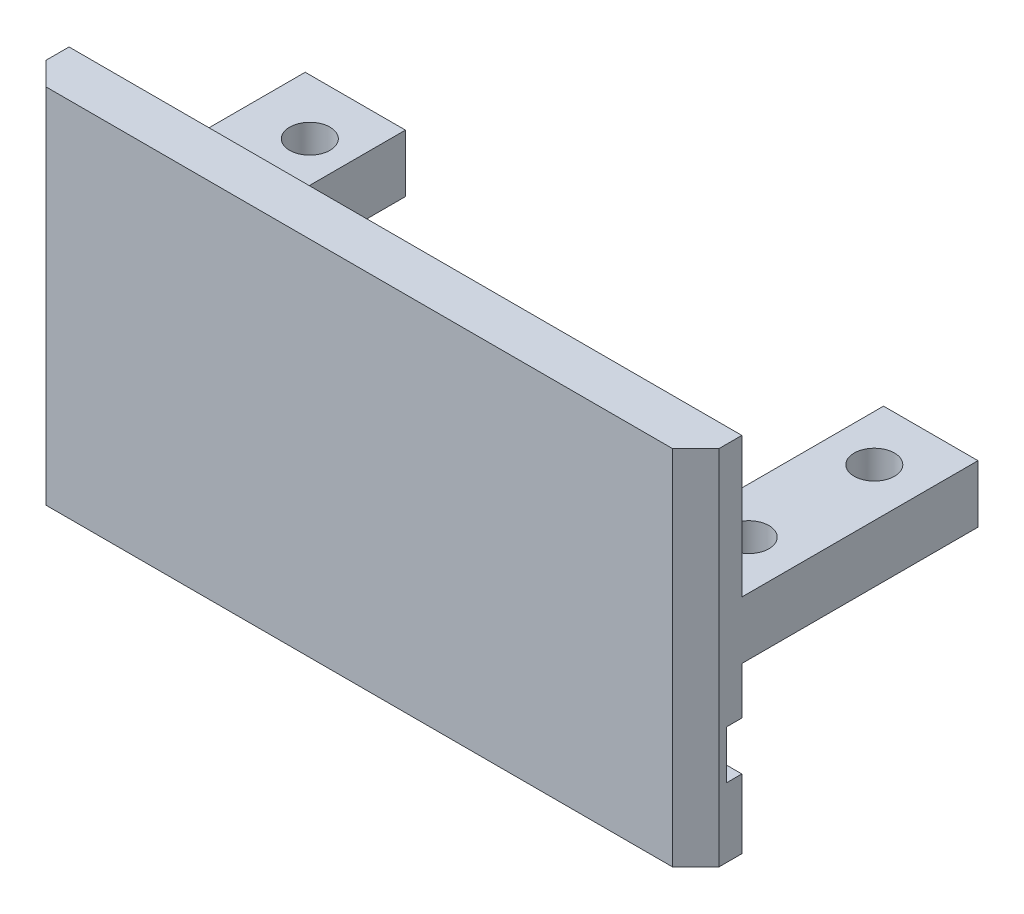
ISO-10303-21;
HEADER;
FILE_DESCRIPTION(('STEP AP214'),'2;1');
FILE_NAME('part.step','',(''),(''),'','','');
FILE_SCHEMA(('AUTOMOTIVE_DESIGN { 1 0 10303 214 1 1 1 1 }'));
ENDSEC;
DATA;
#1=APPLICATION_CONTEXT('core data for automotive mechanical design processes');
#2=APPLICATION_PROTOCOL_DEFINITION('international standard','automotive_design',2000,#1);
#3=PRODUCT_CONTEXT('',#1,'mechanical');
#4=PRODUCT('Part','Part','',(#3));
#5=PRODUCT_RELATED_PRODUCT_CATEGORY('part','',(#4));
#6=PRODUCT_DEFINITION_FORMATION('','',#4);
#7=PRODUCT_DEFINITION_CONTEXT('part definition',#1,'design');
#8=PRODUCT_DEFINITION('design','',#6,#7);
#9=PRODUCT_DEFINITION_SHAPE('','',#8);
#10=(LENGTH_UNIT() NAMED_UNIT(*) SI_UNIT(.MILLI.,.METRE.));
#11=(NAMED_UNIT(*) PLANE_ANGLE_UNIT() SI_UNIT($,.RADIAN.));
#12=(NAMED_UNIT(*) SI_UNIT($,.STERADIAN.) SOLID_ANGLE_UNIT());
#13=UNCERTAINTY_MEASURE_WITH_UNIT(LENGTH_MEASURE(1.E-05),#10,'distance_accuracy_value','');
#14=(GEOMETRIC_REPRESENTATION_CONTEXT(3) GLOBAL_UNCERTAINTY_ASSIGNED_CONTEXT((#13)) GLOBAL_UNIT_ASSIGNED_CONTEXT((#10,
#11,#12)) REPRESENTATION_CONTEXT('',''));
#15=CARTESIAN_POINT('',(0.,0.,0.));
#16=DIRECTION('',(0.,0.,1.));
#17=DIRECTION('',(1.,0.,0.));
#18=AXIS2_PLACEMENT_3D('',#15,#16,#17);
#19=CARTESIAN_POINT('',(0.,0.,0.));
#20=DIRECTION('',(0.,0.,1.));
#21=DIRECTION('',(1.,0.,0.));
#22=AXIS2_PLACEMENT_3D('',#19,#20,#21);
#23=PLANE('',#22);
#24=DIRECTION('',(0.,1.,0.));
#25=VECTOR('',#24,1.);
#26=CARTESIAN_POINT('',(29.2,15.725,0.));
#27=LINE('',#26,#25);
#28=CARTESIAN_POINT('',(29.2,-5.525,0.));
#29=VERTEX_POINT('',#28);
#30=CARTESIAN_POINT('',(29.2,-1.425,0.));
#31=VERTEX_POINT('',#30);
#32=EDGE_CURVE('E290',#29,#31,#27,.T.);
#33=ORIENTED_EDGE('',*,*,#32,.F.);
#34=DIRECTION('',(1.,0.,0.));
#35=VECTOR('',#34,1.);
#36=CARTESIAN_POINT('',(29.2,-5.525,0.));
#37=LINE('',#36,#35);
#38=CARTESIAN_POINT('',(-29.2,-5.525,0.));
#39=VERTEX_POINT('',#38);
#40=EDGE_CURVE('E186',#39,#29,#37,.T.);
#41=ORIENTED_EDGE('',*,*,#40,.F.);
#42=DIRECTION('',(0.,-1.,0.));
#43=VECTOR('',#42,1.);
#44=CARTESIAN_POINT('',(-29.2,15.725,0.));
#45=LINE('',#44,#43);
#46=CARTESIAN_POINT('',(-29.2,-1.425,0.));
#47=VERTEX_POINT('',#46);
#48=EDGE_CURVE('E297',#47,#39,#45,.T.);
#49=ORIENTED_EDGE('',*,*,#48,.F.);
#50=DIRECTION('',(-1.,0.,0.));
#51=VECTOR('',#50,1.);
#52=CARTESIAN_POINT('',(-20.5,-1.425,0.));
#53=LINE('',#52,#51);
#54=CARTESIAN_POINT('',(-20.5,-1.425,0.));
#55=VERTEX_POINT('',#54);
#56=EDGE_CURVE('E235',#55,#47,#53,.T.);
#57=ORIENTED_EDGE('',*,*,#56,.F.);
#58=DIRECTION('',(0.,-1.,0.));
#59=VECTOR('',#58,1.);
#60=CARTESIAN_POINT('',(-20.5,3.575,0.));
#61=LINE('',#60,#59);
#62=CARTESIAN_POINT('',(-20.5,3.575,0.));
#63=VERTEX_POINT('',#62);
#64=EDGE_CURVE('E239',#63,#55,#61,.T.);
#65=ORIENTED_EDGE('',*,*,#64,.F.);
#66=DIRECTION('',(1.,0.,0.));
#67=VECTOR('',#66,1.);
#68=CARTESIAN_POINT('',(-20.5,3.575,0.));
#69=LINE('',#68,#67);
#70=CARTESIAN_POINT('',(-29.2,3.575,0.));
#71=VERTEX_POINT('',#70);
#72=EDGE_CURVE('E233',#71,#63,#69,.T.);
#73=ORIENTED_EDGE('',*,*,#72,.F.);
#74=CARTESIAN_POINT('',(-29.2,15.725,0.));
#75=VERTEX_POINT('',#74);
#76=EDGE_CURVE('E294',#75,#71,#45,.T.);
#77=ORIENTED_EDGE('',*,*,#76,.F.);
#78=DIRECTION('',(-1.,0.,0.));
#79=VECTOR('',#78,1.);
#80=CARTESIAN_POINT('',(-29.2,15.725,0.));
#81=LINE('',#80,#79);
#82=CARTESIAN_POINT('',(29.2,15.725,0.));
#83=VERTEX_POINT('',#82);
#84=EDGE_CURVE('E289',#83,#75,#81,.T.);
#85=ORIENTED_EDGE('',*,*,#84,.F.);
#86=CARTESIAN_POINT('',(29.2,3.575,0.));
#87=VERTEX_POINT('',#86);
#88=EDGE_CURVE('E279',#87,#83,#27,.T.);
#89=ORIENTED_EDGE('',*,*,#88,.F.);
#90=DIRECTION('',(1.,0.,0.));
#91=VECTOR('',#90,1.);
#92=CARTESIAN_POINT('',(29.2,3.575,0.));
#93=LINE('',#92,#91);
#94=CARTESIAN_POINT('',(21.,3.575,0.));
#95=VERTEX_POINT('',#94);
#96=EDGE_CURVE('E254',#95,#87,#93,.T.);
#97=ORIENTED_EDGE('',*,*,#96,.F.);
#98=DIRECTION('',(0.,1.,0.));
#99=VECTOR('',#98,1.);
#100=CARTESIAN_POINT('',(21.,3.575,0.));
#101=LINE('',#100,#99);
#102=CARTESIAN_POINT('',(21.,-1.425,0.));
#103=VERTEX_POINT('',#102);
#104=EDGE_CURVE('E263',#103,#95,#101,.T.);
#105=ORIENTED_EDGE('',*,*,#104,.F.);
#106=DIRECTION('',(-1.,0.,0.));
#107=VECTOR('',#106,1.);
#108=CARTESIAN_POINT('',(29.2,-1.425,0.));
#109=LINE('',#108,#107);
#110=EDGE_CURVE('E242',#31,#103,#109,.T.);
#111=ORIENTED_EDGE('',*,*,#110,.F.);
#112=EDGE_LOOP('',(#33,#41,#49,#57,#65,#73,#77,#85,#89,#97,#105,#111));
#113=FACE_BOUND('',#112,.T.);
#114=ADVANCED_FACE('F42',(#113),#23,.F.);
#115=CARTESIAN_POINT('',(-29.2,-9.725,0.));
#116=VERTEX_POINT('',#115);
#117=CARTESIAN_POINT('',(-29.2,-15.725,0.));
#118=VERTEX_POINT('',#117);
#119=EDGE_CURVE('E293',#116,#118,#45,.T.);
#120=ORIENTED_EDGE('',*,*,#119,.F.);
#121=DIRECTION('',(-1.,0.,0.));
#122=VECTOR('',#121,1.);
#123=CARTESIAN_POINT('',(29.2,-9.725,0.));
#124=LINE('',#123,#122);
#125=CARTESIAN_POINT('',(29.2,-9.725,0.));
#126=VERTEX_POINT('',#125);
#127=EDGE_CURVE('E348',#126,#116,#124,.T.);
#128=ORIENTED_EDGE('',*,*,#127,.F.);
#129=CARTESIAN_POINT('',(29.2,-15.725,0.));
#130=VERTEX_POINT('',#129);
#131=EDGE_CURVE('E191',#130,#126,#27,.T.);
#132=ORIENTED_EDGE('',*,*,#131,.F.);
#133=DIRECTION('',(1.,0.,0.));
#134=VECTOR('',#133,1.);
#135=CARTESIAN_POINT('',(-29.2,-15.725,0.));
#136=LINE('',#135,#134);
#137=EDGE_CURVE('E284',#118,#130,#136,.T.);
#138=ORIENTED_EDGE('',*,*,#137,.F.);
#139=EDGE_LOOP('',(#120,#128,#132,#138));
#140=FACE_BOUND('',#139,.T.);
#141=ADVANCED_FACE('F347',(#140),#23,.F.);
#142=CARTESIAN_POINT('',(29.2,15.725,4.));
#143=DIRECTION('',(-1.,0.,0.));
#144=DIRECTION('',(0.,-1.,0.));
#145=AXIS2_PLACEMENT_3D('',#142,#143,#144);
#146=PLANE('',#145);
#147=DIRECTION('',(0.,0.,-1.));
#148=VECTOR('',#147,1.);
#149=CARTESIAN_POINT('',(29.2,15.725,4.));
#150=LINE('',#149,#148);
#151=CARTESIAN_POINT('',(29.2,15.725,2.));
#152=VERTEX_POINT('',#151);
#153=EDGE_CURVE('E305',#152,#83,#150,.T.);
#154=ORIENTED_EDGE('',*,*,#153,.F.);
#155=DIRECTION('',(0.,-1.,0.));
#156=VECTOR('',#155,1.);
#157=CARTESIAN_POINT('',(29.2,-15.725,2.));
#158=LINE('',#157,#156);
#159=CARTESIAN_POINT('',(29.2,-15.725,2.));
#160=VERTEX_POINT('',#159);
#161=EDGE_CURVE('E66',#152,#160,#158,.T.);
#162=ORIENTED_EDGE('',*,*,#161,.T.);
#163=DIRECTION('',(0.,0.,-1.));
#164=VECTOR('',#163,1.);
#165=CARTESIAN_POINT('',(29.2,-15.725,4.));
#166=LINE('',#165,#164);
#167=EDGE_CURVE('E287',#160,#130,#166,.T.);
#168=ORIENTED_EDGE('',*,*,#167,.T.);
#169=ORIENTED_EDGE('',*,*,#131,.T.);
#170=DIRECTION('',(0.,0.,-1.));
#171=VECTOR('',#170,1.);
#172=CARTESIAN_POINT('',(29.2,-9.725,1.35));
#173=LINE('',#172,#171);
#174=CARTESIAN_POINT('',(29.2,-9.725,1.35));
#175=VERTEX_POINT('',#174);
#176=EDGE_CURVE('E171',#175,#126,#173,.T.);
#177=ORIENTED_EDGE('',*,*,#176,.F.);
#178=DIRECTION('',(0.,-1.,0.));
#179=VECTOR('',#178,1.);
#180=CARTESIAN_POINT('',(29.2,-5.525,1.35));
#181=LINE('',#180,#179);
#182=CARTESIAN_POINT('',(29.2,-5.525,1.35));
#183=VERTEX_POINT('',#182);
#184=EDGE_CURVE('E178',#183,#175,#181,.T.);
#185=ORIENTED_EDGE('',*,*,#184,.F.);
#186=DIRECTION('',(0.,0.,-1.));
#187=VECTOR('',#186,1.);
#188=CARTESIAN_POINT('',(29.2,-5.525,1.35));
#189=LINE('',#188,#187);
#190=EDGE_CURVE('E202',#183,#29,#189,.T.);
#191=ORIENTED_EDGE('',*,*,#190,.T.);
#192=ORIENTED_EDGE('',*,*,#32,.T.);
#193=DIRECTION('',(0.,0.,1.));
#194=VECTOR('',#193,1.);
#195=CARTESIAN_POINT('',(29.2,-1.425,-20.5));
#196=LINE('',#195,#194);
#197=CARTESIAN_POINT('',(29.2,-1.425,-20.5));
#198=VERTEX_POINT('',#197);
#199=EDGE_CURVE('E276',#198,#31,#196,.T.);
#200=ORIENTED_EDGE('',*,*,#199,.F.);
#201=DIRECTION('',(0.,-1.,0.));
#202=VECTOR('',#201,1.);
#203=CARTESIAN_POINT('',(29.2,3.575,-20.5));
#204=LINE('',#203,#202);
#205=CARTESIAN_POINT('',(29.2,3.575,-20.5));
#206=VERTEX_POINT('',#205);
#207=EDGE_CURVE('E250',#206,#198,#204,.T.);
#208=ORIENTED_EDGE('',*,*,#207,.F.);
#209=DIRECTION('',(0.,0.,1.));
#210=VECTOR('',#209,1.);
#211=CARTESIAN_POINT('',(29.2,3.575,-20.5));
#212=LINE('',#211,#210);
#213=EDGE_CURVE('E260',#206,#87,#212,.T.);
#214=ORIENTED_EDGE('',*,*,#213,.T.);
#215=ORIENTED_EDGE('',*,*,#88,.T.);
#216=EDGE_LOOP('',(#154,#162,#168,#169,#177,#185,#191,#192,#200,#208,#214,#215));
#217=FACE_BOUND('',#216,.T.);
#218=ADVANCED_FACE('F189',(#217),#146,.F.);
#219=CARTESIAN_POINT('',(-29.2,15.725,4.));
#220=DIRECTION('',(0.,-1.,0.));
#221=DIRECTION('',(0.,0.,-1.));
#222=AXIS2_PLACEMENT_3D('',#219,#220,#221);
#223=PLANE('',#222);
#224=DIRECTION('',(-1.,0.,0.));
#225=VECTOR('',#224,1.);
#226=CARTESIAN_POINT('',(-29.2,15.725,4.));
#227=LINE('',#226,#225);
#228=CARTESIAN_POINT('',(27.2,15.725,4.));
#229=VERTEX_POINT('',#228);
#230=CARTESIAN_POINT('',(-27.2,15.725,4.));
#231=VERTEX_POINT('',#230);
#232=EDGE_CURVE('E280',#229,#231,#227,.T.);
#233=ORIENTED_EDGE('',*,*,#232,.F.);
#234=DIRECTION('',(0.707106781186547,0.,-0.707106781186548));
#235=VECTOR('',#234,1.);
#236=CARTESIAN_POINT('',(27.2,15.725,4.));
#237=LINE('',#236,#235);
#238=EDGE_CURVE('E315',#229,#152,#237,.T.);
#239=ORIENTED_EDGE('',*,*,#238,.T.);
#240=ORIENTED_EDGE('',*,*,#153,.T.);
#241=ORIENTED_EDGE('',*,*,#84,.T.);
#242=DIRECTION('',(0.,0.,-1.));
#243=VECTOR('',#242,1.);
#244=CARTESIAN_POINT('',(-29.2,15.725,4.));
#245=LINE('',#244,#243);
#246=CARTESIAN_POINT('',(-29.2,15.725,2.));
#247=VERTEX_POINT('',#246);
#248=EDGE_CURVE('E303',#247,#75,#245,.T.);
#249=ORIENTED_EDGE('',*,*,#248,.F.);
#250=DIRECTION('',(0.707106781186548,0.,0.707106781186547));
#251=VECTOR('',#250,1.);
#252=CARTESIAN_POINT('',(-27.2,15.725,4.));
#253=LINE('',#252,#251);
#254=EDGE_CURVE('E313',#247,#231,#253,.T.);
#255=ORIENTED_EDGE('',*,*,#254,.T.);
#256=EDGE_LOOP('',(#233,#239,#240,#241,#249,#255));
#257=FACE_BOUND('',#256,.T.);
#258=ADVANCED_FACE('F328',(#257),#223,.F.);
#259=CARTESIAN_POINT('',(-29.2,15.725,4.));
#260=DIRECTION('',(1.,0.,0.));
#261=DIRECTION('',(0.,1.,0.));
#262=AXIS2_PLACEMENT_3D('',#259,#260,#261);
#263=PLANE('',#262);
#264=DIRECTION('',(0.,0.,-1.));
#265=VECTOR('',#264,1.);
#266=CARTESIAN_POINT('',(-29.2,-15.725,4.));
#267=LINE('',#266,#265);
#268=CARTESIAN_POINT('',(-29.2,-15.725,2.));
#269=VERTEX_POINT('',#268);
#270=EDGE_CURVE('E301',#269,#118,#267,.T.);
#271=ORIENTED_EDGE('',*,*,#270,.F.);
#272=DIRECTION('',(0.,1.,0.));
#273=VECTOR('',#272,1.);
#274=CARTESIAN_POINT('',(-29.2,15.725,2.));
#275=LINE('',#274,#273);
#276=EDGE_CURVE('E11',#269,#247,#275,.T.);
#277=ORIENTED_EDGE('',*,*,#276,.T.);
#278=ORIENTED_EDGE('',*,*,#248,.T.);
#279=ORIENTED_EDGE('',*,*,#76,.T.);
#280=DIRECTION('',(0.,0.,1.));
#281=VECTOR('',#280,1.);
#282=CARTESIAN_POINT('',(-29.2,3.575,-20.5));
#283=LINE('',#282,#281);
#284=CARTESIAN_POINT('',(-29.2,3.575,-20.5));
#285=VERTEX_POINT('',#284);
#286=EDGE_CURVE('E227',#285,#71,#283,.T.);
#287=ORIENTED_EDGE('',*,*,#286,.F.);
#288=DIRECTION('',(0.,1.,0.));
#289=VECTOR('',#288,1.);
#290=CARTESIAN_POINT('',(-29.2,3.575,-20.5));
#291=LINE('',#290,#289);
#292=CARTESIAN_POINT('',(-29.2,-1.425,-20.5));
#293=VERTEX_POINT('',#292);
#294=EDGE_CURVE('E244',#293,#285,#291,.T.);
#295=ORIENTED_EDGE('',*,*,#294,.F.);
#296=DIRECTION('',(0.,0.,1.));
#297=VECTOR('',#296,1.);
#298=CARTESIAN_POINT('',(-29.2,-1.425,-20.5));
#299=LINE('',#298,#297);
#300=EDGE_CURVE('E225',#293,#47,#299,.T.);
#301=ORIENTED_EDGE('',*,*,#300,.T.);
#302=ORIENTED_EDGE('',*,*,#48,.T.);
#303=DIRECTION('',(0.,0.,-1.));
#304=VECTOR('',#303,1.);
#305=CARTESIAN_POINT('',(-29.2,-5.525,1.35));
#306=LINE('',#305,#304);
#307=CARTESIAN_POINT('',(-29.2,-5.525,1.35));
#308=VERTEX_POINT('',#307);
#309=EDGE_CURVE('E193',#308,#39,#306,.T.);
#310=ORIENTED_EDGE('',*,*,#309,.F.);
#311=DIRECTION('',(0.,1.,0.));
#312=VECTOR('',#311,1.);
#313=CARTESIAN_POINT('',(-29.2,-5.525,1.35));
#314=LINE('',#313,#312);
#315=CARTESIAN_POINT('',(-29.2,-9.725,1.35));
#316=VERTEX_POINT('',#315);
#317=EDGE_CURVE('E177',#316,#308,#314,.T.);
#318=ORIENTED_EDGE('',*,*,#317,.F.);
#319=DIRECTION('',(0.,0.,-1.));
#320=VECTOR('',#319,1.);
#321=CARTESIAN_POINT('',(-29.2,-9.725,1.35));
#322=LINE('',#321,#320);
#323=EDGE_CURVE('E174',#316,#116,#322,.T.);
#324=ORIENTED_EDGE('',*,*,#323,.T.);
#325=ORIENTED_EDGE('',*,*,#119,.T.);
#326=EDGE_LOOP('',(#271,#277,#278,#279,#287,#295,#301,#302,#310,#318,#324,#325));
#327=FACE_BOUND('',#326,.T.);
#328=ADVANCED_FACE('F342',(#327),#263,.F.);
#329=CARTESIAN_POINT('',(-29.2,-15.725,4.));
#330=DIRECTION('',(0.,1.,0.));
#331=DIRECTION('',(0.,0.,1.));
#332=AXIS2_PLACEMENT_3D('',#329,#330,#331);
#333=PLANE('',#332);
#334=ORIENTED_EDGE('',*,*,#167,.F.);
#335=DIRECTION('',(-0.707106781186547,0.,0.707106781186548));
#336=VECTOR('',#335,1.);
#337=CARTESIAN_POINT('',(27.2,-15.725,4.));
#338=LINE('',#337,#336);
#339=CARTESIAN_POINT('',(27.2,-15.725,4.));
#340=VERTEX_POINT('',#339);
#341=EDGE_CURVE('E51',#160,#340,#338,.T.);
#342=ORIENTED_EDGE('',*,*,#341,.T.);
#343=DIRECTION('',(1.,0.,0.));
#344=VECTOR('',#343,1.);
#345=CARTESIAN_POINT('',(-29.2,-15.725,4.));
#346=LINE('',#345,#344);
#347=CARTESIAN_POINT('',(-27.2,-15.725,4.));
#348=VERTEX_POINT('',#347);
#349=EDGE_CURVE('E283',#348,#340,#346,.T.);
#350=ORIENTED_EDGE('',*,*,#349,.F.);
#351=DIRECTION('',(-0.707106781186548,0.,-0.707106781186547));
#352=VECTOR('',#351,1.);
#353=CARTESIAN_POINT('',(-27.2,-15.725,4.));
#354=LINE('',#353,#352);
#355=EDGE_CURVE('E58',#348,#269,#354,.T.);
#356=ORIENTED_EDGE('',*,*,#355,.T.);
#357=ORIENTED_EDGE('',*,*,#270,.T.);
#358=ORIENTED_EDGE('',*,*,#137,.T.);
#359=EDGE_LOOP('',(#334,#342,#350,#356,#357,#358));
#360=FACE_BOUND('',#359,.T.);
#361=ADVANCED_FACE('F319',(#360),#333,.F.);
#362=CARTESIAN_POINT('',(0.,0.,4.));
#363=DIRECTION('',(0.,0.,1.));
#364=DIRECTION('',(1.,0.,0.));
#365=AXIS2_PLACEMENT_3D('',#362,#363,#364);
#366=PLANE('',#365);
#367=ORIENTED_EDGE('',*,*,#349,.T.);
#368=DIRECTION('',(0.,1.,0.));
#369=VECTOR('',#368,1.);
#370=CARTESIAN_POINT('',(27.2,15.725,4.));
#371=LINE('',#370,#369);
#372=EDGE_CURVE('E310',#340,#229,#371,.T.);
#373=ORIENTED_EDGE('',*,*,#372,.T.);
#374=ORIENTED_EDGE('',*,*,#232,.T.);
#375=DIRECTION('',(0.,-1.,0.));
#376=VECTOR('',#375,1.);
#377=CARTESIAN_POINT('',(-27.2,-15.725,4.));
#378=LINE('',#377,#376);
#379=EDGE_CURVE('E307',#231,#348,#378,.T.);
#380=ORIENTED_EDGE('',*,*,#379,.T.);
#381=EDGE_LOOP('',(#367,#373,#374,#380));
#382=FACE_BOUND('',#381,.T.);
#383=ADVANCED_FACE('F323',(#382),#366,.T.);
#384=CARTESIAN_POINT('',(29.2,-1.425,-20.5));
#385=DIRECTION('',(0.,1.,0.));
#386=DIRECTION('',(0.,0.,1.));
#387=AXIS2_PLACEMENT_3D('',#384,#385,#386);
#388=PLANE('',#387);
#389=CARTESIAN_POINT('',(25.,-1.425,-15.7));
#390=DIRECTION('',(0.,1.,0.));
#391=DIRECTION('',(0.,0.,1.));
#392=AXIS2_PLACEMENT_3D('',#389,#390,#391);
#393=CIRCLE('',#392,1.75);
#394=CARTESIAN_POINT('',(25.,-1.425,-13.95));
#395=VERTEX_POINT('',#394);
#396=EDGE_CURVE('E205',#395,#395,#393,.F.);
#397=ORIENTED_EDGE('',*,*,#396,.F.);
#398=EDGE_LOOP('',(#397));
#399=FACE_BOUND('',#398,.T.);
#400=CARTESIAN_POINT('',(25.,-1.425,-4.8));
#401=DIRECTION('',(0.,1.,0.));
#402=DIRECTION('',(0.,0.,1.));
#403=AXIS2_PLACEMENT_3D('',#400,#401,#402);
#404=CIRCLE('',#403,1.75);
#405=CARTESIAN_POINT('',(25.,-1.425,-3.05));
#406=VERTEX_POINT('',#405);
#407=EDGE_CURVE('E220',#406,#406,#404,.F.);
#408=ORIENTED_EDGE('',*,*,#407,.F.);
#409=EDGE_LOOP('',(#408));
#410=FACE_BOUND('',#409,.T.);
#411=ORIENTED_EDGE('',*,*,#110,.T.);
#412=DIRECTION('',(0.,0.,1.));
#413=VECTOR('',#412,1.);
#414=CARTESIAN_POINT('',(21.,-1.425,-20.5));
#415=LINE('',#414,#413);
#416=CARTESIAN_POINT('',(21.,-1.425,-20.5));
#417=VERTEX_POINT('',#416);
#418=EDGE_CURVE('E273',#417,#103,#415,.T.);
#419=ORIENTED_EDGE('',*,*,#418,.F.);
#420=DIRECTION('',(-1.,0.,0.));
#421=VECTOR('',#420,1.);
#422=CARTESIAN_POINT('',(29.2,-1.425,-20.5));
#423=LINE('',#422,#421);
#424=EDGE_CURVE('E253',#198,#417,#423,.T.);
#425=ORIENTED_EDGE('',*,*,#424,.F.);
#426=ORIENTED_EDGE('',*,*,#199,.T.);
#427=EDGE_LOOP('',(#411,#419,#425,#426));
#428=FACE_BOUND('',#427,.T.);
#429=ADVANCED_FACE('F550',(#399,#410,#428),#388,.F.);
#430=CARTESIAN_POINT('',(21.,3.575,-20.5));
#431=DIRECTION('',(1.,0.,0.));
#432=DIRECTION('',(0.,0.,-1.));
#433=AXIS2_PLACEMENT_3D('',#430,#431,#432);
#434=PLANE('',#433);
#435=ORIENTED_EDGE('',*,*,#104,.T.);
#436=DIRECTION('',(0.,0.,1.));
#437=VECTOR('',#436,1.);
#438=CARTESIAN_POINT('',(21.,3.575,-20.5));
#439=LINE('',#438,#437);
#440=CARTESIAN_POINT('',(21.,3.575,-20.5));
#441=VERTEX_POINT('',#440);
#442=EDGE_CURVE('E270',#441,#95,#439,.T.);
#443=ORIENTED_EDGE('',*,*,#442,.F.);
#444=DIRECTION('',(0.,1.,0.));
#445=VECTOR('',#444,1.);
#446=CARTESIAN_POINT('',(21.,3.575,-20.5));
#447=LINE('',#446,#445);
#448=EDGE_CURVE('E256',#417,#441,#447,.T.);
#449=ORIENTED_EDGE('',*,*,#448,.F.);
#450=ORIENTED_EDGE('',*,*,#418,.T.);
#451=EDGE_LOOP('',(#435,#443,#449,#450));
#452=FACE_BOUND('',#451,.T.);
#453=ADVANCED_FACE('F575',(#452),#434,.F.);
#454=CARTESIAN_POINT('',(29.2,3.575,-20.5));
#455=DIRECTION('',(0.,-1.,0.));
#456=DIRECTION('',(0.,0.,-1.));
#457=AXIS2_PLACEMENT_3D('',#454,#455,#456);
#458=PLANE('',#457);
#459=CARTESIAN_POINT('',(25.,3.57499999999999,-15.7));
#460=DIRECTION('',(0.,1.,0.));
#461=DIRECTION('',(1.,0.,0.));
#462=AXIS2_PLACEMENT_3D('',#459,#460,#461);
#463=CIRCLE('',#462,1.75);
#464=CARTESIAN_POINT('',(26.75,3.57499999999999,-15.7));
#465=VERTEX_POINT('',#464);
#466=EDGE_CURVE('E210',#465,#465,#463,.T.);
#467=ORIENTED_EDGE('',*,*,#466,.F.);
#468=EDGE_LOOP('',(#467));
#469=FACE_BOUND('',#468,.T.);
#470=CARTESIAN_POINT('',(25.,3.57499999999999,-4.8));
#471=DIRECTION('',(0.,1.,0.));
#472=DIRECTION('',(-1.,0.,0.));
#473=AXIS2_PLACEMENT_3D('',#470,#471,#472);
#474=CIRCLE('',#473,1.75);
#475=CARTESIAN_POINT('',(23.25,3.575,-4.8));
#476=VERTEX_POINT('',#475);
#477=EDGE_CURVE('E213',#476,#476,#474,.T.);
#478=ORIENTED_EDGE('',*,*,#477,.F.);
#479=EDGE_LOOP('',(#478));
#480=FACE_BOUND('',#479,.T.);
#481=ORIENTED_EDGE('',*,*,#96,.T.);
#482=ORIENTED_EDGE('',*,*,#213,.F.);
#483=DIRECTION('',(1.,0.,0.));
#484=VECTOR('',#483,1.);
#485=CARTESIAN_POINT('',(29.2,3.575,-20.5));
#486=LINE('',#485,#484);
#487=EDGE_CURVE('E258',#441,#206,#486,.T.);
#488=ORIENTED_EDGE('',*,*,#487,.F.);
#489=ORIENTED_EDGE('',*,*,#442,.T.);
#490=EDGE_LOOP('',(#481,#482,#488,#489));
#491=FACE_BOUND('',#490,.T.);
#492=ADVANCED_FACE('F581',(#469,#480,#491),#458,.F.);
#493=CARTESIAN_POINT('',(0.,0.,-20.5));
#494=DIRECTION('',(0.,0.,-1.));
#495=DIRECTION('',(-1.,0.,0.));
#496=AXIS2_PLACEMENT_3D('',#493,#494,#495);
#497=PLANE('',#496);
#498=ORIENTED_EDGE('',*,*,#207,.T.);
#499=ORIENTED_EDGE('',*,*,#424,.T.);
#500=ORIENTED_EDGE('',*,*,#448,.T.);
#501=ORIENTED_EDGE('',*,*,#487,.T.);
#502=EDGE_LOOP('',(#498,#499,#500,#501));
#503=FACE_BOUND('',#502,.T.);
#504=ADVANCED_FACE('F434',(#503),#497,.T.);
#505=CARTESIAN_POINT('',(-20.5,3.575,-20.5));
#506=DIRECTION('',(-1.,0.,0.));
#507=DIRECTION('',(0.,0.,1.));
#508=AXIS2_PLACEMENT_3D('',#505,#506,#507);
#509=PLANE('',#508);
#510=ORIENTED_EDGE('',*,*,#64,.T.);
#511=DIRECTION('',(0.,0.,1.));
#512=VECTOR('',#511,1.);
#513=CARTESIAN_POINT('',(-20.5,-1.425,-20.5));
#514=LINE('',#513,#512);
#515=CARTESIAN_POINT('',(-20.5,-1.425,-20.5));
#516=VERTEX_POINT('',#515);
#517=EDGE_CURVE('E223',#516,#55,#514,.T.);
#518=ORIENTED_EDGE('',*,*,#517,.F.);
#519=DIRECTION('',(0.,-1.,0.));
#520=VECTOR('',#519,1.);
#521=CARTESIAN_POINT('',(-20.5,3.575,-20.5));
#522=LINE('',#521,#520);
#523=CARTESIAN_POINT('',(-20.5,3.575,-20.5));
#524=VERTEX_POINT('',#523);
#525=EDGE_CURVE('E236',#524,#516,#522,.T.);
#526=ORIENTED_EDGE('',*,*,#525,.F.);
#527=DIRECTION('',(0.,0.,1.));
#528=VECTOR('',#527,1.);
#529=CARTESIAN_POINT('',(-20.5,3.575,-20.5));
#530=LINE('',#529,#528);
#531=EDGE_CURVE('E229',#524,#63,#530,.T.);
#532=ORIENTED_EDGE('',*,*,#531,.T.);
#533=EDGE_LOOP('',(#510,#518,#526,#532));
#534=FACE_BOUND('',#533,.T.);
#535=ADVANCED_FACE('F369',(#534),#509,.F.);
#536=CARTESIAN_POINT('',(-20.5,-1.425,-20.5));
#537=DIRECTION('',(0.,1.,0.));
#538=DIRECTION('',(-1.,0.,0.));
#539=AXIS2_PLACEMENT_3D('',#536,#537,#538);
#540=PLANE('',#539);
#541=CARTESIAN_POINT('',(-24.,-1.425,-4.8));
#542=DIRECTION('',(0.,1.,0.));
#543=DIRECTION('',(-1.,0.,0.));
#544=AXIS2_PLACEMENT_3D('',#541,#542,#543);
#545=CIRCLE('',#544,1.75);
#546=CARTESIAN_POINT('',(-25.75,-1.425,-4.8));
#547=VERTEX_POINT('',#546);
#548=EDGE_CURVE('E206',#547,#547,#545,.F.);
#549=ORIENTED_EDGE('',*,*,#548,.F.);
#550=EDGE_LOOP('',(#549));
#551=FACE_BOUND('',#550,.T.);
#552=CARTESIAN_POINT('',(-24.,-1.425,-15.7));
#553=DIRECTION('',(0.,1.,0.));
#554=DIRECTION('',(-1.,0.,0.));
#555=AXIS2_PLACEMENT_3D('',#552,#553,#554);
#556=CIRCLE('',#555,1.75);
#557=CARTESIAN_POINT('',(-25.75,-1.425,-15.7));
#558=VERTEX_POINT('',#557);
#559=EDGE_CURVE('E198',#558,#558,#556,.F.);
#560=ORIENTED_EDGE('',*,*,#559,.F.);
#561=EDGE_LOOP('',(#560));
#562=FACE_BOUND('',#561,.T.);
#563=ORIENTED_EDGE('',*,*,#56,.T.);
#564=ORIENTED_EDGE('',*,*,#300,.F.);
#565=DIRECTION('',(-1.,0.,0.));
#566=VECTOR('',#565,1.);
#567=CARTESIAN_POINT('',(-20.5,-1.425,-20.5));
#568=LINE('',#567,#566);
#569=EDGE_CURVE('E246',#516,#293,#568,.T.);
#570=ORIENTED_EDGE('',*,*,#569,.F.);
#571=ORIENTED_EDGE('',*,*,#517,.T.);
#572=EDGE_LOOP('',(#563,#564,#570,#571));
#573=FACE_BOUND('',#572,.T.);
#574=ADVANCED_FACE('F365',(#551,#562,#573),#540,.F.);
#575=CARTESIAN_POINT('',(-20.5,3.575,-20.5));
#576=DIRECTION('',(0.,-1.,0.));
#577=DIRECTION('',(0.,0.,-1.));
#578=AXIS2_PLACEMENT_3D('',#575,#576,#577);
#579=PLANE('',#578);
#580=CARTESIAN_POINT('',(-24.,3.57500000000001,-4.8));
#581=DIRECTION('',(0.,1.,0.));
#582=DIRECTION('',(-1.,0.,0.));
#583=AXIS2_PLACEMENT_3D('',#580,#581,#582);
#584=CIRCLE('',#583,1.75);
#585=CARTESIAN_POINT('',(-25.75,3.57500000000001,-4.8));
#586=VERTEX_POINT('',#585);
#587=EDGE_CURVE('E209',#586,#586,#584,.T.);
#588=ORIENTED_EDGE('',*,*,#587,.F.);
#589=EDGE_LOOP('',(#588));
#590=FACE_BOUND('',#589,.T.);
#591=CARTESIAN_POINT('',(-24.,3.57500000000001,-15.7));
#592=DIRECTION('',(0.,1.,0.));
#593=DIRECTION('',(1.,0.,0.));
#594=AXIS2_PLACEMENT_3D('',#591,#592,#593);
#595=CIRCLE('',#594,1.75);
#596=CARTESIAN_POINT('',(-22.25,3.57500000000001,-15.7));
#597=VERTEX_POINT('',#596);
#598=EDGE_CURVE('E201',#597,#597,#595,.T.);
#599=ORIENTED_EDGE('',*,*,#598,.F.);
#600=EDGE_LOOP('',(#599));
#601=FACE_BOUND('',#600,.T.);
#602=ORIENTED_EDGE('',*,*,#72,.T.);
#603=ORIENTED_EDGE('',*,*,#531,.F.);
#604=DIRECTION('',(1.,0.,0.));
#605=VECTOR('',#604,1.);
#606=CARTESIAN_POINT('',(-20.5,3.575,-20.5));
#607=LINE('',#606,#605);
#608=EDGE_CURVE('E232',#285,#524,#607,.T.);
#609=ORIENTED_EDGE('',*,*,#608,.F.);
#610=ORIENTED_EDGE('',*,*,#286,.T.);
#611=EDGE_LOOP('',(#602,#603,#609,#610));
#612=FACE_BOUND('',#611,.T.);
#613=ADVANCED_FACE('F374',(#590,#601,#612),#579,.F.);
#614=CARTESIAN_POINT('',(0.,0.,-20.5));
#615=DIRECTION('',(0.,0.,-1.));
#616=DIRECTION('',(-1.,0.,0.));
#617=AXIS2_PLACEMENT_3D('',#614,#615,#616);
#618=PLANE('',#617);
#619=ORIENTED_EDGE('',*,*,#525,.T.);
#620=ORIENTED_EDGE('',*,*,#569,.T.);
#621=ORIENTED_EDGE('',*,*,#294,.T.);
#622=ORIENTED_EDGE('',*,*,#608,.T.);
#623=EDGE_LOOP('',(#619,#620,#621,#622));
#624=FACE_BOUND('',#623,.T.);
#625=ADVANCED_FACE('F376',(#624),#618,.T.);
#626=CARTESIAN_POINT('',(-24.,-15.726,-15.7));
#627=DIRECTION('',(0.,1.,0.));
#628=DIRECTION('',(-1.,0.,0.));
#629=AXIS2_PLACEMENT_3D('',#626,#627,#628);
#630=CYLINDRICAL_SURFACE('',#629,1.75);
#631=ORIENTED_EDGE('',*,*,#598,.T.);
#632=EDGE_LOOP('',(#631));
#633=FACE_BOUND('',#632,.T.);
#634=ORIENTED_EDGE('',*,*,#559,.T.);
#635=EDGE_LOOP('',(#634));
#636=FACE_BOUND('',#635,.T.);
#637=ADVANCED_FACE('F378',(#633,#636),#630,.F.);
#638=CARTESIAN_POINT('',(-24.,-15.726,-4.8));
#639=DIRECTION('',(0.,1.,0.));
#640=DIRECTION('',(-1.,0.,0.));
#641=AXIS2_PLACEMENT_3D('',#638,#639,#640);
#642=CYLINDRICAL_SURFACE('',#641,1.75);
#643=ORIENTED_EDGE('',*,*,#587,.T.);
#644=EDGE_LOOP('',(#643));
#645=FACE_BOUND('',#644,.T.);
#646=ORIENTED_EDGE('',*,*,#548,.T.);
#647=EDGE_LOOP('',(#646));
#648=FACE_BOUND('',#647,.T.);
#649=ADVANCED_FACE('F384',(#645,#648),#642,.F.);
#650=CARTESIAN_POINT('',(25.,-15.726,-4.8));
#651=DIRECTION('',(0.,1.,0.));
#652=DIRECTION('',(-1.,0.,0.));
#653=AXIS2_PLACEMENT_3D('',#650,#651,#652);
#654=CYLINDRICAL_SURFACE('',#653,1.75);
#655=ORIENTED_EDGE('',*,*,#477,.T.);
#656=EDGE_LOOP('',(#655));
#657=FACE_BOUND('',#656,.T.);
#658=ORIENTED_EDGE('',*,*,#407,.T.);
#659=EDGE_LOOP('',(#658));
#660=FACE_BOUND('',#659,.T.);
#661=ADVANCED_FACE('F424',(#657,#660),#654,.F.);
#662=CARTESIAN_POINT('',(25.,-15.726,-15.7));
#663=DIRECTION('',(0.,1.,0.));
#664=DIRECTION('',(-1.,0.,0.));
#665=AXIS2_PLACEMENT_3D('',#662,#663,#664);
#666=CYLINDRICAL_SURFACE('',#665,1.75);
#667=ORIENTED_EDGE('',*,*,#466,.T.);
#668=EDGE_LOOP('',(#667));
#669=FACE_BOUND('',#668,.T.);
#670=ORIENTED_EDGE('',*,*,#396,.T.);
#671=EDGE_LOOP('',(#670));
#672=FACE_BOUND('',#671,.T.);
#673=ADVANCED_FACE('F420',(#669,#672),#666,.F.);
#674=CARTESIAN_POINT('',(29.2,-5.525,1.35));
#675=DIRECTION('',(0.,1.,0.));
#676=DIRECTION('',(0.,0.,1.));
#677=AXIS2_PLACEMENT_3D('',#674,#675,#676);
#678=PLANE('',#677);
#679=ORIENTED_EDGE('',*,*,#40,.T.);
#680=ORIENTED_EDGE('',*,*,#190,.F.);
#681=DIRECTION('',(1.,0.,0.));
#682=VECTOR('',#681,1.);
#683=CARTESIAN_POINT('',(29.2,-5.525,1.35));
#684=LINE('',#683,#682);
#685=EDGE_CURVE('E184',#308,#183,#684,.T.);
#686=ORIENTED_EDGE('',*,*,#685,.F.);
#687=ORIENTED_EDGE('',*,*,#309,.T.);
#688=EDGE_LOOP('',(#679,#680,#686,#687));
#689=FACE_BOUND('',#688,.T.);
#690=ADVANCED_FACE('F356',(#689),#678,.F.);
#691=CARTESIAN_POINT('',(29.2,-9.725,1.35));
#692=DIRECTION('',(0.,-1.,0.));
#693=DIRECTION('',(0.,0.,-1.));
#694=AXIS2_PLACEMENT_3D('',#691,#692,#693);
#695=PLANE('',#694);
#696=ORIENTED_EDGE('',*,*,#127,.T.);
#697=ORIENTED_EDGE('',*,*,#323,.F.);
#698=DIRECTION('',(-1.,0.,0.));
#699=VECTOR('',#698,1.);
#700=CARTESIAN_POINT('',(29.2,-9.725,1.35));
#701=LINE('',#700,#699);
#702=EDGE_CURVE('E167',#175,#316,#701,.T.);
#703=ORIENTED_EDGE('',*,*,#702,.F.);
#704=ORIENTED_EDGE('',*,*,#176,.T.);
#705=EDGE_LOOP('',(#696,#697,#703,#704));
#706=FACE_BOUND('',#705,.T.);
#707=ADVANCED_FACE('F169',(#706),#695,.F.);
#708=CARTESIAN_POINT('',(0.,0.,1.35));
#709=DIRECTION('',(0.,0.,-1.));
#710=DIRECTION('',(-1.,0.,0.));
#711=AXIS2_PLACEMENT_3D('',#708,#709,#710);
#712=PLANE('',#711);
#713=ORIENTED_EDGE('',*,*,#184,.T.);
#714=ORIENTED_EDGE('',*,*,#702,.T.);
#715=ORIENTED_EDGE('',*,*,#317,.T.);
#716=ORIENTED_EDGE('',*,*,#685,.T.);
#717=EDGE_LOOP('',(#713,#714,#715,#716));
#718=FACE_BOUND('',#717,.T.);
#719=ADVANCED_FACE('F182',(#718),#712,.T.);
#720=CARTESIAN_POINT('',(27.2,0.,4.));
#721=DIRECTION('',(0.707106781186548,0.,0.707106781186547));
#722=DIRECTION('',(0.,-1.,0.));
#723=AXIS2_PLACEMENT_3D('',#720,#721,#722);
#724=PLANE('',#723);
#725=ORIENTED_EDGE('',*,*,#341,.F.);
#726=ORIENTED_EDGE('',*,*,#161,.F.);
#727=ORIENTED_EDGE('',*,*,#238,.F.);
#728=ORIENTED_EDGE('',*,*,#372,.F.);
#729=EDGE_LOOP('',(#725,#726,#727,#728));
#730=FACE_BOUND('',#729,.T.);
#731=ADVANCED_FACE('F326',(#730),#724,.T.);
#732=CARTESIAN_POINT('',(-27.2,0.,4.));
#733=DIRECTION('',(-0.707106781186547,0.,0.707106781186548));
#734=DIRECTION('',(0.,1.,0.));
#735=AXIS2_PLACEMENT_3D('',#732,#733,#734);
#736=PLANE('',#735);
#737=ORIENTED_EDGE('',*,*,#254,.F.);
#738=ORIENTED_EDGE('',*,*,#276,.F.);
#739=ORIENTED_EDGE('',*,*,#355,.F.);
#740=ORIENTED_EDGE('',*,*,#379,.F.);
#741=EDGE_LOOP('',(#737,#738,#739,#740));
#742=FACE_BOUND('',#741,.T.);
#743=ADVANCED_FACE('F45',(#742),#736,.T.);
#744=CLOSED_SHELL('',(#114,#141,#218,#258,#328,#361,#383,#429,#453,#492,#504,#535,#574,#613,
#625,#637,#649,#661,#673,#690,#707,#719,#731,#743));
#745=MANIFOLD_SOLID_BREP('B2',#744);
#746=ADVANCED_BREP_SHAPE_REPRESENTATION('',(#18,#745),#14);
#747=SHAPE_DEFINITION_REPRESENTATION(#9,#746);
ENDSEC;
END-ISO-10303-21;
